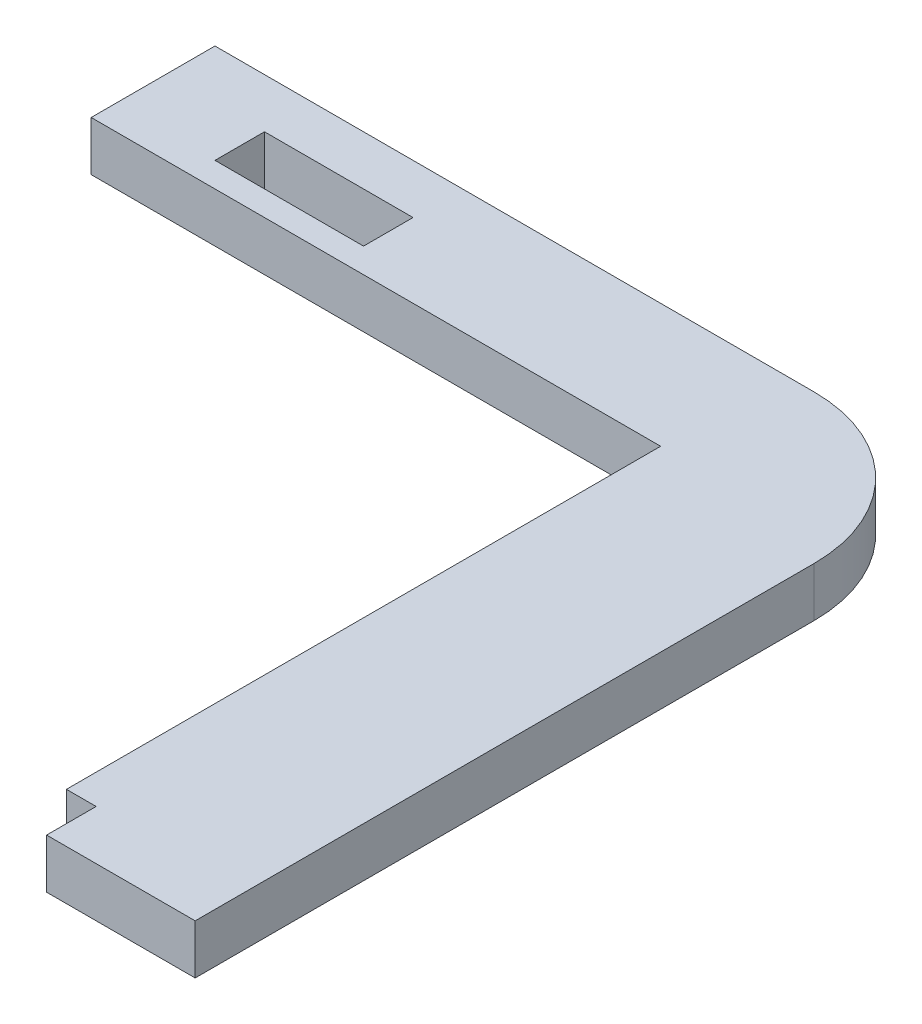
ISO-10303-21;
HEADER;
FILE_DESCRIPTION(('STEP AP214'),'2;1');
FILE_NAME('part.step','',(''),(''),'','','');
FILE_SCHEMA(('AUTOMOTIVE_DESIGN { 1 0 10303 214 1 1 1 1 }'));
ENDSEC;
DATA;
#1=APPLICATION_CONTEXT('core data for automotive mechanical design processes');
#2=APPLICATION_PROTOCOL_DEFINITION('international standard','automotive_design',2000,#1);
#3=PRODUCT_CONTEXT('',#1,'mechanical');
#4=PRODUCT('Part','Part','',(#3));
#5=PRODUCT_RELATED_PRODUCT_CATEGORY('part','',(#4));
#6=PRODUCT_DEFINITION_FORMATION('','',#4);
#7=PRODUCT_DEFINITION_CONTEXT('part definition',#1,'design');
#8=PRODUCT_DEFINITION('design','',#6,#7);
#9=PRODUCT_DEFINITION_SHAPE('','',#8);
#10=(LENGTH_UNIT() NAMED_UNIT(*) SI_UNIT(.MILLI.,.METRE.));
#11=(NAMED_UNIT(*) PLANE_ANGLE_UNIT() SI_UNIT($,.RADIAN.));
#12=(NAMED_UNIT(*) SI_UNIT($,.STERADIAN.) SOLID_ANGLE_UNIT());
#13=UNCERTAINTY_MEASURE_WITH_UNIT(LENGTH_MEASURE(1.E-05),#10,'distance_accuracy_value','');
#14=(GEOMETRIC_REPRESENTATION_CONTEXT(3) GLOBAL_UNCERTAINTY_ASSIGNED_CONTEXT((#13)) GLOBAL_UNIT_ASSIGNED_CONTEXT((#10,
#11,#12)) REPRESENTATION_CONTEXT('',''));
#15=CARTESIAN_POINT('',(0.,0.,0.));
#16=DIRECTION('',(0.,0.,1.));
#17=DIRECTION('',(1.,0.,0.));
#18=AXIS2_PLACEMENT_3D('',#15,#16,#17);
#19=CARTESIAN_POINT('',(0.,5.,0.));
#20=DIRECTION('',(0.,1.,0.));
#21=DIRECTION('',(0.,0.,1.));
#22=AXIS2_PLACEMENT_3D('',#19,#20,#21);
#23=PLANE('',#22);
#24=DIRECTION('',(0.,0.,-1.));
#25=VECTOR('',#24,1.);
#26=CARTESIAN_POINT('',(-11.5,5.,-50.));
#27=LINE('',#26,#25);
#28=CARTESIAN_POINT('',(-11.5,5.,27.5));
#29=VERTEX_POINT('',#28);
#30=CARTESIAN_POINT('',(-11.5,5.,-35.));
#31=VERTEX_POINT('',#30);
#32=EDGE_CURVE('E189',#29,#31,#27,.T.);
#33=ORIENTED_EDGE('',*,*,#32,.T.);
#34=CARTESIAN_POINT('',(-26.5,5.,-35.));
#35=DIRECTION('',(0.,1.,0.));
#36=DIRECTION('',(0.,0.,1.));
#37=AXIS2_PLACEMENT_3D('',#34,#35,#36);
#38=CIRCLE('',#37,15.);
#39=CARTESIAN_POINT('',(-26.5,5.,-50.));
#40=VERTEX_POINT('',#39);
#41=EDGE_CURVE('E11',#31,#40,#38,.T.);
#42=ORIENTED_EDGE('',*,*,#41,.T.);
#43=DIRECTION('',(-1.,0.,0.));
#44=VECTOR('',#43,1.);
#45=CARTESIAN_POINT('',(-11.5,5.,-50.));
#46=LINE('',#45,#44);
#47=CARTESIAN_POINT('',(-87.,5.,-50.));
#48=VERTEX_POINT('',#47);
#49=EDGE_CURVE('E192',#40,#48,#46,.T.);
#50=ORIENTED_EDGE('',*,*,#49,.T.);
#51=DIRECTION('',(0.,0.,1.));
#52=VECTOR('',#51,1.);
#53=CARTESIAN_POINT('',(-87.,5.,-50.));
#54=LINE('',#53,#52);
#55=CARTESIAN_POINT('',(-87.,5.,-37.5));
#56=VERTEX_POINT('',#55);
#57=EDGE_CURVE('E196',#48,#56,#54,.T.);
#58=ORIENTED_EDGE('',*,*,#57,.T.);
#59=DIRECTION('',(1.,0.,0.));
#60=VECTOR('',#59,1.);
#61=CARTESIAN_POINT('',(-29.5,5.,-37.5));
#62=LINE('',#61,#60);
#63=CARTESIAN_POINT('',(-29.5,5.,-37.5));
#64=VERTEX_POINT('',#63);
#65=EDGE_CURVE('E199',#56,#64,#62,.T.);
#66=ORIENTED_EDGE('',*,*,#65,.T.);
#67=DIRECTION('',(0.,0.,1.));
#68=VECTOR('',#67,1.);
#69=CARTESIAN_POINT('',(-29.5,5.,22.5));
#70=LINE('',#69,#68);
#71=CARTESIAN_POINT('',(-29.5,5.,22.5));
#72=VERTEX_POINT('',#71);
#73=EDGE_CURVE('E202',#64,#72,#70,.T.);
#74=ORIENTED_EDGE('',*,*,#73,.T.);
#75=DIRECTION('',(1.,0.,0.));
#76=VECTOR('',#75,1.);
#77=CARTESIAN_POINT('',(-26.5,5.,22.5));
#78=LINE('',#77,#76);
#79=CARTESIAN_POINT('',(-26.5,5.,22.5));
#80=VERTEX_POINT('',#79);
#81=EDGE_CURVE('E205',#72,#80,#78,.T.);
#82=ORIENTED_EDGE('',*,*,#81,.T.);
#83=DIRECTION('',(0.,0.,1.));
#84=VECTOR('',#83,1.);
#85=CARTESIAN_POINT('',(-26.5,5.,22.5));
#86=LINE('',#85,#84);
#87=CARTESIAN_POINT('',(-26.5,5.,27.5));
#88=VERTEX_POINT('',#87);
#89=EDGE_CURVE('E208',#80,#88,#86,.T.);
#90=ORIENTED_EDGE('',*,*,#89,.T.);
#91=DIRECTION('',(1.,0.,0.));
#92=VECTOR('',#91,1.);
#93=CARTESIAN_POINT('',(-26.5,5.,27.5));
#94=LINE('',#93,#92);
#95=EDGE_CURVE('E211',#88,#29,#94,.T.);
#96=ORIENTED_EDGE('',*,*,#95,.T.);
#97=EDGE_LOOP('',(#33,#42,#50,#58,#66,#74,#82,#90,#96));
#98=FACE_BOUND('',#97,.T.);
#99=DIRECTION('',(1.,0.,0.));
#100=VECTOR('',#99,1.);
#101=CARTESIAN_POINT('',(-77.,5.,-40.));
#102=LINE('',#101,#100);
#103=CARTESIAN_POINT('',(-77.,5.,-40.));
#104=VERTEX_POINT('',#103);
#105=CARTESIAN_POINT('',(-62.,5.,-40.));
#106=VERTEX_POINT('',#105);
#107=EDGE_CURVE('E147',#104,#106,#102,.T.);
#108=ORIENTED_EDGE('',*,*,#107,.F.);
#109=DIRECTION('',(0.,0.,1.));
#110=VECTOR('',#109,1.);
#111=CARTESIAN_POINT('',(-77.,5.,-40.));
#112=LINE('',#111,#110);
#113=CARTESIAN_POINT('',(-77.,5.,-45.));
#114=VERTEX_POINT('',#113);
#115=EDGE_CURVE('E136',#114,#104,#112,.T.);
#116=ORIENTED_EDGE('',*,*,#115,.F.);
#117=DIRECTION('',(-1.,0.,0.));
#118=VECTOR('',#117,1.);
#119=CARTESIAN_POINT('',(-77.,5.,-45.));
#120=LINE('',#119,#118);
#121=CARTESIAN_POINT('',(-62.,5.,-45.));
#122=VERTEX_POINT('',#121);
#123=EDGE_CURVE('E165',#122,#114,#120,.T.);
#124=ORIENTED_EDGE('',*,*,#123,.F.);
#125=DIRECTION('',(0.,0.,-1.));
#126=VECTOR('',#125,1.);
#127=CARTESIAN_POINT('',(-62.,5.,-40.));
#128=LINE('',#127,#126);
#129=EDGE_CURVE('E161',#106,#122,#128,.T.);
#130=ORIENTED_EDGE('',*,*,#129,.F.);
#131=EDGE_LOOP('',(#108,#116,#124,#130));
#132=FACE_BOUND('',#131,.T.);
#133=ADVANCED_FACE('F39',(#98,#132),#23,.T.);
#134=CARTESIAN_POINT('',(0.,0.,0.));
#135=DIRECTION('',(0.,1.,0.));
#136=DIRECTION('',(0.,0.,1.));
#137=AXIS2_PLACEMENT_3D('',#134,#135,#136);
#138=PLANE('',#137);
#139=DIRECTION('',(-1.,0.,0.));
#140=VECTOR('',#139,1.);
#141=CARTESIAN_POINT('',(-11.5,0.,-50.));
#142=LINE('',#141,#140);
#143=CARTESIAN_POINT('',(-26.5,0.,-50.));
#144=VERTEX_POINT('',#143);
#145=CARTESIAN_POINT('',(-87.,0.,-50.));
#146=VERTEX_POINT('',#145);
#147=EDGE_CURVE('E217',#144,#146,#142,.T.);
#148=ORIENTED_EDGE('',*,*,#147,.F.);
#149=CARTESIAN_POINT('',(-26.5,0.,-35.));
#150=DIRECTION('',(0.,1.,0.));
#151=DIRECTION('',(0.,0.,1.));
#152=AXIS2_PLACEMENT_3D('',#149,#150,#151);
#153=CIRCLE('',#152,15.);
#154=CARTESIAN_POINT('',(-11.5,0.,-35.));
#155=VERTEX_POINT('',#154);
#156=EDGE_CURVE('E62',#144,#155,#153,.F.);
#157=ORIENTED_EDGE('',*,*,#156,.T.);
#158=DIRECTION('',(0.,0.,-1.));
#159=VECTOR('',#158,1.);
#160=CARTESIAN_POINT('',(-11.5,0.,-50.));
#161=LINE('',#160,#159);
#162=CARTESIAN_POINT('',(-11.5,0.,27.5));
#163=VERTEX_POINT('',#162);
#164=EDGE_CURVE('E156',#163,#155,#161,.T.);
#165=ORIENTED_EDGE('',*,*,#164,.F.);
#166=DIRECTION('',(1.,0.,0.));
#167=VECTOR('',#166,1.);
#168=CARTESIAN_POINT('',(-26.5,0.,27.5));
#169=LINE('',#168,#167);
#170=CARTESIAN_POINT('',(-26.5,0.,27.5));
#171=VERTEX_POINT('',#170);
#172=EDGE_CURVE('E193',#171,#163,#169,.T.);
#173=ORIENTED_EDGE('',*,*,#172,.F.);
#174=DIRECTION('',(0.,0.,1.));
#175=VECTOR('',#174,1.);
#176=CARTESIAN_POINT('',(-26.5,0.,22.5));
#177=LINE('',#176,#175);
#178=CARTESIAN_POINT('',(-26.5,0.,22.5));
#179=VERTEX_POINT('',#178);
#180=EDGE_CURVE('E232',#179,#171,#177,.T.);
#181=ORIENTED_EDGE('',*,*,#180,.F.);
#182=DIRECTION('',(1.,0.,0.));
#183=VECTOR('',#182,1.);
#184=CARTESIAN_POINT('',(-26.5,0.,22.5));
#185=LINE('',#184,#183);
#186=CARTESIAN_POINT('',(-29.5,0.,22.5));
#187=VERTEX_POINT('',#186);
#188=EDGE_CURVE('E229',#187,#179,#185,.T.);
#189=ORIENTED_EDGE('',*,*,#188,.F.);
#190=DIRECTION('',(0.,0.,1.));
#191=VECTOR('',#190,1.);
#192=CARTESIAN_POINT('',(-29.5,0.,22.5));
#193=LINE('',#192,#191);
#194=CARTESIAN_POINT('',(-29.5,0.,-37.5));
#195=VERTEX_POINT('',#194);
#196=EDGE_CURVE('E226',#195,#187,#193,.T.);
#197=ORIENTED_EDGE('',*,*,#196,.F.);
#198=DIRECTION('',(1.,0.,0.));
#199=VECTOR('',#198,1.);
#200=CARTESIAN_POINT('',(-29.5,0.,-37.5));
#201=LINE('',#200,#199);
#202=CARTESIAN_POINT('',(-87.,0.,-37.5));
#203=VERTEX_POINT('',#202);
#204=EDGE_CURVE('E223',#203,#195,#201,.T.);
#205=ORIENTED_EDGE('',*,*,#204,.F.);
#206=DIRECTION('',(0.,0.,1.));
#207=VECTOR('',#206,1.);
#208=CARTESIAN_POINT('',(-87.,0.,-50.));
#209=LINE('',#208,#207);
#210=EDGE_CURVE('E220',#146,#203,#209,.T.);
#211=ORIENTED_EDGE('',*,*,#210,.F.);
#212=EDGE_LOOP('',(#148,#157,#165,#173,#181,#189,#197,#205,#211));
#213=FACE_BOUND('',#212,.T.);
#214=DIRECTION('',(0.,0.,1.));
#215=VECTOR('',#214,1.);
#216=CARTESIAN_POINT('',(-77.,0.,-40.));
#217=LINE('',#216,#215);
#218=CARTESIAN_POINT('',(-77.,0.,-45.));
#219=VERTEX_POINT('',#218);
#220=CARTESIAN_POINT('',(-77.,0.,-40.));
#221=VERTEX_POINT('',#220);
#222=EDGE_CURVE('E170',#219,#221,#217,.T.);
#223=ORIENTED_EDGE('',*,*,#222,.T.);
#224=DIRECTION('',(1.,0.,0.));
#225=VECTOR('',#224,1.);
#226=CARTESIAN_POINT('',(-77.,0.,-40.));
#227=LINE('',#226,#225);
#228=CARTESIAN_POINT('',(-62.,0.,-40.));
#229=VERTEX_POINT('',#228);
#230=EDGE_CURVE('E154',#221,#229,#227,.T.);
#231=ORIENTED_EDGE('',*,*,#230,.T.);
#232=DIRECTION('',(0.,0.,-1.));
#233=VECTOR('',#232,1.);
#234=CARTESIAN_POINT('',(-62.,0.,-40.));
#235=LINE('',#234,#233);
#236=CARTESIAN_POINT('',(-62.,0.,-45.));
#237=VERTEX_POINT('',#236);
#238=EDGE_CURVE('E175',#229,#237,#235,.T.);
#239=ORIENTED_EDGE('',*,*,#238,.T.);
#240=DIRECTION('',(-1.,0.,0.));
#241=VECTOR('',#240,1.);
#242=CARTESIAN_POINT('',(-77.,0.,-45.));
#243=LINE('',#242,#241);
#244=EDGE_CURVE('E148',#237,#219,#243,.T.);
#245=ORIENTED_EDGE('',*,*,#244,.T.);
#246=EDGE_LOOP('',(#223,#231,#239,#245));
#247=FACE_BOUND('',#246,.T.);
#248=ADVANCED_FACE('F278',(#213,#247),#138,.F.);
#249=CARTESIAN_POINT('',(-11.5,5.,-50.));
#250=DIRECTION('',(-1.,0.,0.));
#251=DIRECTION('',(0.,0.,1.));
#252=AXIS2_PLACEMENT_3D('',#249,#250,#251);
#253=PLANE('',#252);
#254=ORIENTED_EDGE('',*,*,#164,.T.);
#255=DIRECTION('',(0.,-1.,0.));
#256=VECTOR('',#255,1.);
#257=CARTESIAN_POINT('',(-11.5,5.,-35.));
#258=LINE('',#257,#256);
#259=EDGE_CURVE('E48',#155,#31,#258,.F.);
#260=ORIENTED_EDGE('',*,*,#259,.T.);
#261=ORIENTED_EDGE('',*,*,#32,.F.);
#262=DIRECTION('',(0.,-1.,0.));
#263=VECTOR('',#262,1.);
#264=CARTESIAN_POINT('',(-11.5,5.,27.5));
#265=LINE('',#264,#263);
#266=EDGE_CURVE('E214',#29,#163,#265,.T.);
#267=ORIENTED_EDGE('',*,*,#266,.T.);
#268=EDGE_LOOP('',(#254,#260,#261,#267));
#269=FACE_BOUND('',#268,.T.);
#270=ADVANCED_FACE('F306',(#269),#253,.F.);
#271=CARTESIAN_POINT('',(-11.5,5.,-50.));
#272=DIRECTION('',(0.,0.,1.));
#273=DIRECTION('',(1.,0.,0.));
#274=AXIS2_PLACEMENT_3D('',#271,#272,#273);
#275=PLANE('',#274);
#276=ORIENTED_EDGE('',*,*,#49,.F.);
#277=DIRECTION('',(0.,-1.,0.));
#278=VECTOR('',#277,1.);
#279=CARTESIAN_POINT('',(-26.5,5.,-50.));
#280=LINE('',#279,#278);
#281=EDGE_CURVE('E264',#40,#144,#280,.T.);
#282=ORIENTED_EDGE('',*,*,#281,.T.);
#283=ORIENTED_EDGE('',*,*,#147,.T.);
#284=DIRECTION('',(0.,-1.,0.));
#285=VECTOR('',#284,1.);
#286=CARTESIAN_POINT('',(-87.,5.,-50.));
#287=LINE('',#286,#285);
#288=EDGE_CURVE('E260',#48,#146,#287,.T.);
#289=ORIENTED_EDGE('',*,*,#288,.F.);
#290=EDGE_LOOP('',(#276,#282,#283,#289));
#291=FACE_BOUND('',#290,.T.);
#292=ADVANCED_FACE('F273',(#291),#275,.F.);
#293=CARTESIAN_POINT('',(-87.,5.,-50.));
#294=DIRECTION('',(1.,0.,0.));
#295=DIRECTION('',(0.,0.,-1.));
#296=AXIS2_PLACEMENT_3D('',#293,#294,#295);
#297=PLANE('',#296);
#298=ORIENTED_EDGE('',*,*,#210,.T.);
#299=DIRECTION('',(0.,-1.,0.));
#300=VECTOR('',#299,1.);
#301=CARTESIAN_POINT('',(-87.,5.,-37.5));
#302=LINE('',#301,#300);
#303=EDGE_CURVE('E256',#56,#203,#302,.T.);
#304=ORIENTED_EDGE('',*,*,#303,.F.);
#305=ORIENTED_EDGE('',*,*,#57,.F.);
#306=ORIENTED_EDGE('',*,*,#288,.T.);
#307=EDGE_LOOP('',(#298,#304,#305,#306));
#308=FACE_BOUND('',#307,.T.);
#309=ADVANCED_FACE('F284',(#308),#297,.F.);
#310=CARTESIAN_POINT('',(-29.5,5.,-37.5));
#311=DIRECTION('',(0.,0.,-1.));
#312=DIRECTION('',(-1.,0.,0.));
#313=AXIS2_PLACEMENT_3D('',#310,#311,#312);
#314=PLANE('',#313);
#315=ORIENTED_EDGE('',*,*,#204,.T.);
#316=DIRECTION('',(0.,-1.,0.));
#317=VECTOR('',#316,1.);
#318=CARTESIAN_POINT('',(-29.5,5.,-37.5));
#319=LINE('',#318,#317);
#320=EDGE_CURVE('E252',#64,#195,#319,.T.);
#321=ORIENTED_EDGE('',*,*,#320,.F.);
#322=ORIENTED_EDGE('',*,*,#65,.F.);
#323=ORIENTED_EDGE('',*,*,#303,.T.);
#324=EDGE_LOOP('',(#315,#321,#322,#323));
#325=FACE_BOUND('',#324,.T.);
#326=ADVANCED_FACE('F288',(#325),#314,.F.);
#327=CARTESIAN_POINT('',(-29.5,5.,22.5));
#328=DIRECTION('',(1.,0.,0.));
#329=DIRECTION('',(0.,0.,-1.));
#330=AXIS2_PLACEMENT_3D('',#327,#328,#329);
#331=PLANE('',#330);
#332=ORIENTED_EDGE('',*,*,#196,.T.);
#333=DIRECTION('',(0.,-1.,0.));
#334=VECTOR('',#333,1.);
#335=CARTESIAN_POINT('',(-29.5,5.,22.5));
#336=LINE('',#335,#334);
#337=EDGE_CURVE('E248',#72,#187,#336,.T.);
#338=ORIENTED_EDGE('',*,*,#337,.F.);
#339=ORIENTED_EDGE('',*,*,#73,.F.);
#340=ORIENTED_EDGE('',*,*,#320,.T.);
#341=EDGE_LOOP('',(#332,#338,#339,#340));
#342=FACE_BOUND('',#341,.T.);
#343=ADVANCED_FACE('F322',(#342),#331,.F.);
#344=CARTESIAN_POINT('',(-26.5,5.,22.5));
#345=DIRECTION('',(0.,0.,-1.));
#346=DIRECTION('',(-1.,0.,0.));
#347=AXIS2_PLACEMENT_3D('',#344,#345,#346);
#348=PLANE('',#347);
#349=ORIENTED_EDGE('',*,*,#188,.T.);
#350=DIRECTION('',(0.,-1.,0.));
#351=VECTOR('',#350,1.);
#352=CARTESIAN_POINT('',(-26.5,5.,22.5));
#353=LINE('',#352,#351);
#354=EDGE_CURVE('E244',#80,#179,#353,.T.);
#355=ORIENTED_EDGE('',*,*,#354,.F.);
#356=ORIENTED_EDGE('',*,*,#81,.F.);
#357=ORIENTED_EDGE('',*,*,#337,.T.);
#358=EDGE_LOOP('',(#349,#355,#356,#357));
#359=FACE_BOUND('',#358,.T.);
#360=ADVANCED_FACE('F318',(#359),#348,.F.);
#361=CARTESIAN_POINT('',(-26.5,5.,22.5));
#362=DIRECTION('',(1.,0.,0.));
#363=DIRECTION('',(0.,0.,-1.));
#364=AXIS2_PLACEMENT_3D('',#361,#362,#363);
#365=PLANE('',#364);
#366=ORIENTED_EDGE('',*,*,#180,.T.);
#367=DIRECTION('',(0.,-1.,0.));
#368=VECTOR('',#367,1.);
#369=CARTESIAN_POINT('',(-26.5,5.,27.5));
#370=LINE('',#369,#368);
#371=EDGE_CURVE('E240',#88,#171,#370,.T.);
#372=ORIENTED_EDGE('',*,*,#371,.F.);
#373=ORIENTED_EDGE('',*,*,#89,.F.);
#374=ORIENTED_EDGE('',*,*,#354,.T.);
#375=EDGE_LOOP('',(#366,#372,#373,#374));
#376=FACE_BOUND('',#375,.T.);
#377=ADVANCED_FACE('F314',(#376),#365,.F.);
#378=CARTESIAN_POINT('',(-26.5,5.,27.5));
#379=DIRECTION('',(0.,0.,-1.));
#380=DIRECTION('',(-1.,0.,0.));
#381=AXIS2_PLACEMENT_3D('',#378,#379,#380);
#382=PLANE('',#381);
#383=ORIENTED_EDGE('',*,*,#172,.T.);
#384=ORIENTED_EDGE('',*,*,#266,.F.);
#385=ORIENTED_EDGE('',*,*,#95,.F.);
#386=ORIENTED_EDGE('',*,*,#371,.T.);
#387=EDGE_LOOP('',(#383,#384,#385,#386));
#388=FACE_BOUND('',#387,.T.);
#389=ADVANCED_FACE('F311',(#388),#382,.F.);
#390=CARTESIAN_POINT('',(-77.,5.,-40.));
#391=DIRECTION('',(1.,0.,0.));
#392=DIRECTION('',(0.,0.,-1.));
#393=AXIS2_PLACEMENT_3D('',#390,#391,#392);
#394=PLANE('',#393);
#395=ORIENTED_EDGE('',*,*,#222,.F.);
#396=DIRECTION('',(0.,-1.,0.));
#397=VECTOR('',#396,1.);
#398=CARTESIAN_POINT('',(-77.,5.,-45.));
#399=LINE('',#398,#397);
#400=EDGE_CURVE('E142',#114,#219,#399,.T.);
#401=ORIENTED_EDGE('',*,*,#400,.F.);
#402=ORIENTED_EDGE('',*,*,#115,.T.);
#403=DIRECTION('',(0.,-1.,0.));
#404=VECTOR('',#403,1.);
#405=CARTESIAN_POINT('',(-77.,5.,-40.));
#406=LINE('',#405,#404);
#407=EDGE_CURVE('E139',#104,#221,#406,.T.);
#408=ORIENTED_EDGE('',*,*,#407,.T.);
#409=EDGE_LOOP('',(#395,#401,#402,#408));
#410=FACE_BOUND('',#409,.T.);
#411=ADVANCED_FACE('F138',(#410),#394,.T.);
#412=CARTESIAN_POINT('',(-77.,5.,-40.));
#413=DIRECTION('',(0.,0.,-1.));
#414=DIRECTION('',(-1.,0.,0.));
#415=AXIS2_PLACEMENT_3D('',#412,#413,#414);
#416=PLANE('',#415);
#417=ORIENTED_EDGE('',*,*,#230,.F.);
#418=ORIENTED_EDGE('',*,*,#407,.F.);
#419=ORIENTED_EDGE('',*,*,#107,.T.);
#420=DIRECTION('',(0.,-1.,0.));
#421=VECTOR('',#420,1.);
#422=CARTESIAN_POINT('',(-62.,5.,-40.));
#423=LINE('',#422,#421);
#424=EDGE_CURVE('E157',#106,#229,#423,.T.);
#425=ORIENTED_EDGE('',*,*,#424,.T.);
#426=EDGE_LOOP('',(#417,#418,#419,#425));
#427=FACE_BOUND('',#426,.T.);
#428=ADVANCED_FACE('F151',(#427),#416,.T.);
#429=CARTESIAN_POINT('',(-62.,5.,-40.));
#430=DIRECTION('',(-1.,0.,0.));
#431=DIRECTION('',(0.,0.,1.));
#432=AXIS2_PLACEMENT_3D('',#429,#430,#431);
#433=PLANE('',#432);
#434=ORIENTED_EDGE('',*,*,#238,.F.);
#435=ORIENTED_EDGE('',*,*,#424,.F.);
#436=ORIENTED_EDGE('',*,*,#129,.T.);
#437=DIRECTION('',(0.,-1.,0.));
#438=VECTOR('',#437,1.);
#439=CARTESIAN_POINT('',(-62.,5.,-45.));
#440=LINE('',#439,#438);
#441=EDGE_CURVE('E184',#122,#237,#440,.T.);
#442=ORIENTED_EDGE('',*,*,#441,.T.);
#443=EDGE_LOOP('',(#434,#435,#436,#442));
#444=FACE_BOUND('',#443,.T.);
#445=ADVANCED_FACE('F298',(#444),#433,.T.);
#446=CARTESIAN_POINT('',(-77.,5.,-45.));
#447=DIRECTION('',(0.,0.,1.));
#448=DIRECTION('',(1.,0.,0.));
#449=AXIS2_PLACEMENT_3D('',#446,#447,#448);
#450=PLANE('',#449);
#451=ORIENTED_EDGE('',*,*,#244,.F.);
#452=ORIENTED_EDGE('',*,*,#441,.F.);
#453=ORIENTED_EDGE('',*,*,#123,.T.);
#454=ORIENTED_EDGE('',*,*,#400,.T.);
#455=EDGE_LOOP('',(#451,#452,#453,#454));
#456=FACE_BOUND('',#455,.T.);
#457=ADVANCED_FACE('F294',(#456),#450,.T.);
#458=CARTESIAN_POINT('',(-26.5,5.,-35.));
#459=DIRECTION('',(0.,-1.,0.));
#460=DIRECTION('',(0.,0.,-1.));
#461=AXIS2_PLACEMENT_3D('',#458,#459,#460);
#462=CYLINDRICAL_SURFACE('',#461,15.);
#463=ORIENTED_EDGE('',*,*,#41,.F.);
#464=ORIENTED_EDGE('',*,*,#259,.F.);
#465=ORIENTED_EDGE('',*,*,#156,.F.);
#466=ORIENTED_EDGE('',*,*,#281,.F.);
#467=EDGE_LOOP('',(#463,#464,#465,#466));
#468=FACE_BOUND('',#467,.T.);
#469=ADVANCED_FACE('F41',(#468),#462,.T.);
#470=CLOSED_SHELL('',(#133,#248,#270,#292,#309,#326,#343,#360,#377,#389,#411,#428,#445,#457,#469));
#471=MANIFOLD_SOLID_BREP('B2',#470);
#472=ADVANCED_BREP_SHAPE_REPRESENTATION('',(#18,#471),#14);
#473=SHAPE_DEFINITION_REPRESENTATION(#9,#472);
ENDSEC;
END-ISO-10303-21;
